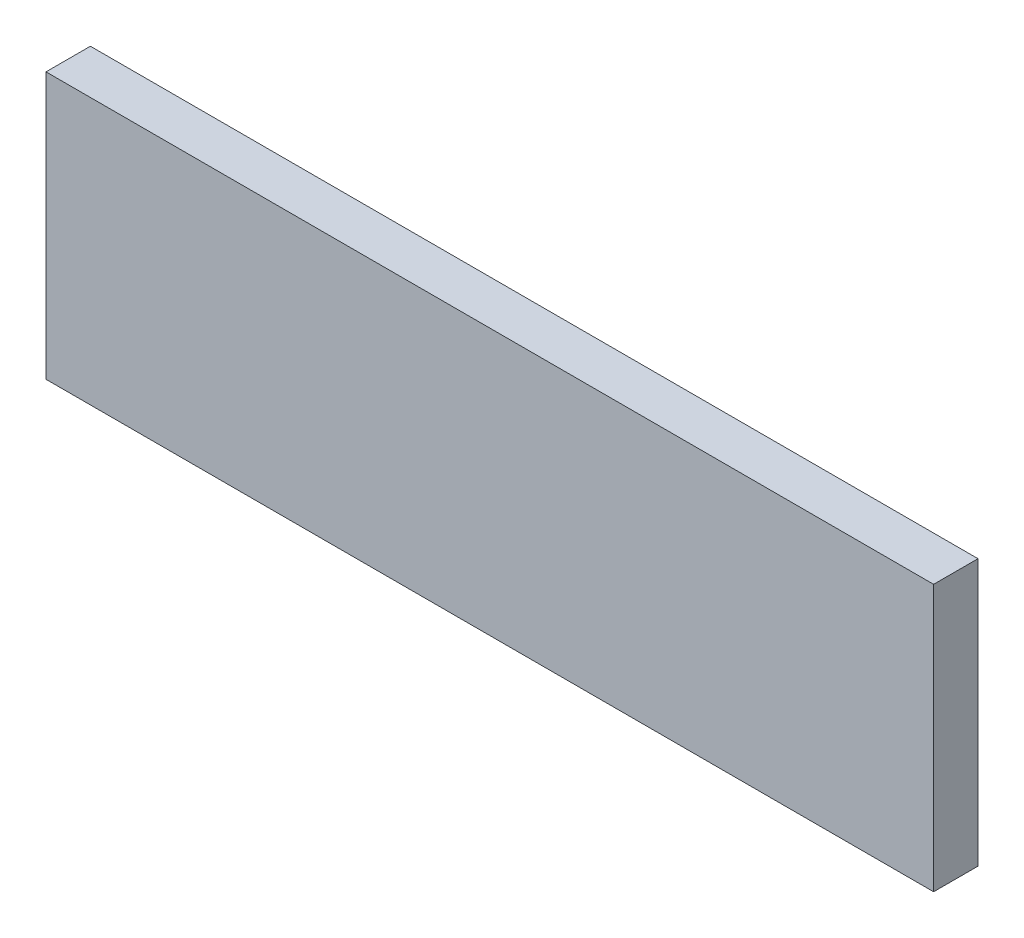
ISO-10303-21;
HEADER;
FILE_DESCRIPTION(('STEP AP214'),'2;1');
FILE_NAME('part.step','',(''),(''),'','','');
FILE_SCHEMA(('AUTOMOTIVE_DESIGN { 1 0 10303 214 1 1 1 1 }'));
ENDSEC;
DATA;
#1=APPLICATION_CONTEXT('core data for automotive mechanical design processes');
#2=APPLICATION_PROTOCOL_DEFINITION('international standard','automotive_design',2000,#1);
#3=PRODUCT_CONTEXT('',#1,'mechanical');
#4=PRODUCT('Part','Part','',(#3));
#5=PRODUCT_RELATED_PRODUCT_CATEGORY('part','',(#4));
#6=PRODUCT_DEFINITION_FORMATION('','',#4);
#7=PRODUCT_DEFINITION_CONTEXT('part definition',#1,'design');
#8=PRODUCT_DEFINITION('design','',#6,#7);
#9=PRODUCT_DEFINITION_SHAPE('','',#8);
#10=(LENGTH_UNIT() NAMED_UNIT(*) SI_UNIT(.MILLI.,.METRE.));
#11=(NAMED_UNIT(*) PLANE_ANGLE_UNIT() SI_UNIT($,.RADIAN.));
#12=(NAMED_UNIT(*) SI_UNIT($,.STERADIAN.) SOLID_ANGLE_UNIT());
#13=UNCERTAINTY_MEASURE_WITH_UNIT(LENGTH_MEASURE(1.E-05),#10,'distance_accuracy_value','');
#14=(GEOMETRIC_REPRESENTATION_CONTEXT(3) GLOBAL_UNCERTAINTY_ASSIGNED_CONTEXT((#13)) GLOBAL_UNIT_ASSIGNED_CONTEXT((#10,
#11,#12)) REPRESENTATION_CONTEXT('',''));
#15=CARTESIAN_POINT('',(0.,0.,0.));
#16=DIRECTION('',(0.,0.,1.));
#17=DIRECTION('',(1.,0.,0.));
#18=AXIS2_PLACEMENT_3D('',#15,#16,#17);
#19=CARTESIAN_POINT('',(-10.6448254886271,30.,-0.451274919967038));
#20=DIRECTION('',(1.,0.,0.));
#21=DIRECTION('',(0.,0.,-1.));
#22=AXIS2_PLACEMENT_3D('',#19,#20,#21);
#23=PLANE('',#22);
#24=DIRECTION('',(0.,0.,1.));
#25=VECTOR('',#24,1.);
#26=CARTESIAN_POINT('',(-10.6448254886271,0.,-0.451274919967038));
#27=LINE('',#26,#25);
#28=CARTESIAN_POINT('',(-10.6448254886271,0.,-0.451274919967038));
#29=VERTEX_POINT('',#28);
#30=CARTESIAN_POINT('',(-10.6448254886271,0.,4.54872508003296));
#31=VERTEX_POINT('',#30);
#32=EDGE_CURVE('E102',#29,#31,#27,.T.);
#33=ORIENTED_EDGE('',*,*,#32,.T.);
#34=DIRECTION('',(0.,-1.,0.));
#35=VECTOR('',#34,1.);
#36=CARTESIAN_POINT('',(-10.6448254886271,30.,4.54872508003296));
#37=LINE('',#36,#35);
#38=CARTESIAN_POINT('',(-10.6448254886271,30.,4.54872508003296));
#39=VERTEX_POINT('',#38);
#40=EDGE_CURVE('E11',#39,#31,#37,.T.);
#41=ORIENTED_EDGE('',*,*,#40,.F.);
#42=DIRECTION('',(0.,0.,1.));
#43=VECTOR('',#42,1.);
#44=CARTESIAN_POINT('',(-10.6448254886271,30.,-0.451274919967038));
#45=LINE('',#44,#43);
#46=CARTESIAN_POINT('',(-10.6448254886271,30.,-0.451274919967038));
#47=VERTEX_POINT('',#46);
#48=EDGE_CURVE('E90',#47,#39,#45,.T.);
#49=ORIENTED_EDGE('',*,*,#48,.F.);
#50=DIRECTION('',(0.,-1.,0.));
#51=VECTOR('',#50,1.);
#52=CARTESIAN_POINT('',(-10.6448254886271,30.,-0.451274919967038));
#53=LINE('',#52,#51);
#54=EDGE_CURVE('E98',#47,#29,#53,.T.);
#55=ORIENTED_EDGE('',*,*,#54,.T.);
#56=EDGE_LOOP('',(#33,#41,#49,#55));
#57=FACE_BOUND('',#56,.T.);
#58=ADVANCED_FACE('F39',(#57),#23,.F.);
#59=CARTESIAN_POINT('',(-10.6448254886271,30.,4.54872508003296));
#60=DIRECTION('',(0.,0.,-1.));
#61=DIRECTION('',(-1.,0.,0.));
#62=AXIS2_PLACEMENT_3D('',#59,#60,#61);
#63=PLANE('',#62);
#64=DIRECTION('',(1.,0.,0.));
#65=VECTOR('',#64,1.);
#66=CARTESIAN_POINT('',(-10.6448254886271,0.,4.54872508003296));
#67=LINE('',#66,#65);
#68=CARTESIAN_POINT('',(89.355174511373,0.,4.54872508003296));
#69=VERTEX_POINT('',#68);
#70=EDGE_CURVE('E94',#31,#69,#67,.T.);
#71=ORIENTED_EDGE('',*,*,#70,.T.);
#72=DIRECTION('',(0.,-1.,0.));
#73=VECTOR('',#72,1.);
#74=CARTESIAN_POINT('',(89.355174511373,30.,4.54872508003296));
#75=LINE('',#74,#73);
#76=CARTESIAN_POINT('',(89.355174511373,30.,4.54872508003296));
#77=VERTEX_POINT('',#76);
#78=EDGE_CURVE('E47',#77,#69,#75,.T.);
#79=ORIENTED_EDGE('',*,*,#78,.F.);
#80=DIRECTION('',(1.,0.,0.));
#81=VECTOR('',#80,1.);
#82=CARTESIAN_POINT('',(-10.6448254886271,30.,4.54872508003296));
#83=LINE('',#82,#81);
#84=EDGE_CURVE('E85',#39,#77,#83,.T.);
#85=ORIENTED_EDGE('',*,*,#84,.F.);
#86=ORIENTED_EDGE('',*,*,#40,.T.);
#87=EDGE_LOOP('',(#71,#79,#85,#86));
#88=FACE_BOUND('',#87,.T.);
#89=ADVANCED_FACE('F93',(#88),#63,.F.);
#90=CARTESIAN_POINT('',(89.355174511373,30.,-0.451274919967038));
#91=DIRECTION('',(-1.,0.,0.));
#92=DIRECTION('',(0.,0.,1.));
#93=AXIS2_PLACEMENT_3D('',#90,#91,#92);
#94=PLANE('',#93);
#95=DIRECTION('',(0.,0.,-1.));
#96=VECTOR('',#95,1.);
#97=CARTESIAN_POINT('',(89.355174511373,0.,-0.451274919967038));
#98=LINE('',#97,#96);
#99=CARTESIAN_POINT('',(89.355174511373,0.,-0.451274919967038));
#100=VERTEX_POINT('',#99);
#101=EDGE_CURVE('E72',#69,#100,#98,.T.);
#102=ORIENTED_EDGE('',*,*,#101,.T.);
#103=DIRECTION('',(0.,-1.,0.));
#104=VECTOR('',#103,1.);
#105=CARTESIAN_POINT('',(89.355174511373,30.,-0.451274919967038));
#106=LINE('',#105,#104);
#107=CARTESIAN_POINT('',(89.355174511373,30.,-0.451274919967038));
#108=VERTEX_POINT('',#107);
#109=EDGE_CURVE('E95',#108,#100,#106,.T.);
#110=ORIENTED_EDGE('',*,*,#109,.F.);
#111=DIRECTION('',(0.,0.,-1.));
#112=VECTOR('',#111,1.);
#113=CARTESIAN_POINT('',(89.355174511373,30.,-0.451274919967038));
#114=LINE('',#113,#112);
#115=EDGE_CURVE('E88',#77,#108,#114,.T.);
#116=ORIENTED_EDGE('',*,*,#115,.F.);
#117=ORIENTED_EDGE('',*,*,#78,.T.);
#118=EDGE_LOOP('',(#102,#110,#116,#117));
#119=FACE_BOUND('',#118,.T.);
#120=ADVANCED_FACE('F96',(#119),#94,.F.);
#121=CARTESIAN_POINT('',(-10.6448254886271,30.,-0.451274919967038));
#122=DIRECTION('',(0.,0.,1.));
#123=DIRECTION('',(1.,0.,0.));
#124=AXIS2_PLACEMENT_3D('',#121,#122,#123);
#125=PLANE('',#124);
#126=DIRECTION('',(-1.,0.,0.));
#127=VECTOR('',#126,1.);
#128=CARTESIAN_POINT('',(-10.6448254886271,0.,-0.451274919967038));
#129=LINE('',#128,#127);
#130=EDGE_CURVE('E78',#100,#29,#129,.T.);
#131=ORIENTED_EDGE('',*,*,#130,.T.);
#132=ORIENTED_EDGE('',*,*,#54,.F.);
#133=DIRECTION('',(-1.,0.,0.));
#134=VECTOR('',#133,1.);
#135=CARTESIAN_POINT('',(-10.6448254886271,30.,-0.451274919967038));
#136=LINE('',#135,#134);
#137=EDGE_CURVE('E55',#108,#47,#136,.T.);
#138=ORIENTED_EDGE('',*,*,#137,.F.);
#139=ORIENTED_EDGE('',*,*,#109,.T.);
#140=EDGE_LOOP('',(#131,#132,#138,#139));
#141=FACE_BOUND('',#140,.T.);
#142=ADVANCED_FACE('F109',(#141),#125,.F.);
#143=CARTESIAN_POINT('',(0.,30.,0.));
#144=DIRECTION('',(0.,1.,0.));
#145=DIRECTION('',(0.,0.,1.));
#146=AXIS2_PLACEMENT_3D('',#143,#144,#145);
#147=PLANE('',#146);
#148=ORIENTED_EDGE('',*,*,#48,.T.);
#149=ORIENTED_EDGE('',*,*,#84,.T.);
#150=ORIENTED_EDGE('',*,*,#115,.T.);
#151=ORIENTED_EDGE('',*,*,#137,.T.);
#152=EDGE_LOOP('',(#148,#149,#150,#151));
#153=FACE_BOUND('',#152,.T.);
#154=ADVANCED_FACE('F86',(#153),#147,.T.);
#155=CARTESIAN_POINT('',(0.,0.,0.));
#156=DIRECTION('',(0.,1.,0.));
#157=DIRECTION('',(0.,0.,1.));
#158=AXIS2_PLACEMENT_3D('',#155,#156,#157);
#159=PLANE('',#158);
#160=ORIENTED_EDGE('',*,*,#32,.F.);
#161=ORIENTED_EDGE('',*,*,#130,.F.);
#162=ORIENTED_EDGE('',*,*,#101,.F.);
#163=ORIENTED_EDGE('',*,*,#70,.F.);
#164=EDGE_LOOP('',(#160,#161,#162,#163));
#165=FACE_BOUND('',#164,.T.);
#166=ADVANCED_FACE('F112',(#165),#159,.F.);
#167=CLOSED_SHELL('',(#58,#89,#120,#142,#154,#166));
#168=MANIFOLD_SOLID_BREP('B2',#167);
#169=ADVANCED_BREP_SHAPE_REPRESENTATION('',(#18,#168),#14);
#170=SHAPE_DEFINITION_REPRESENTATION(#9,#169);
ENDSEC;
END-ISO-10303-21;
